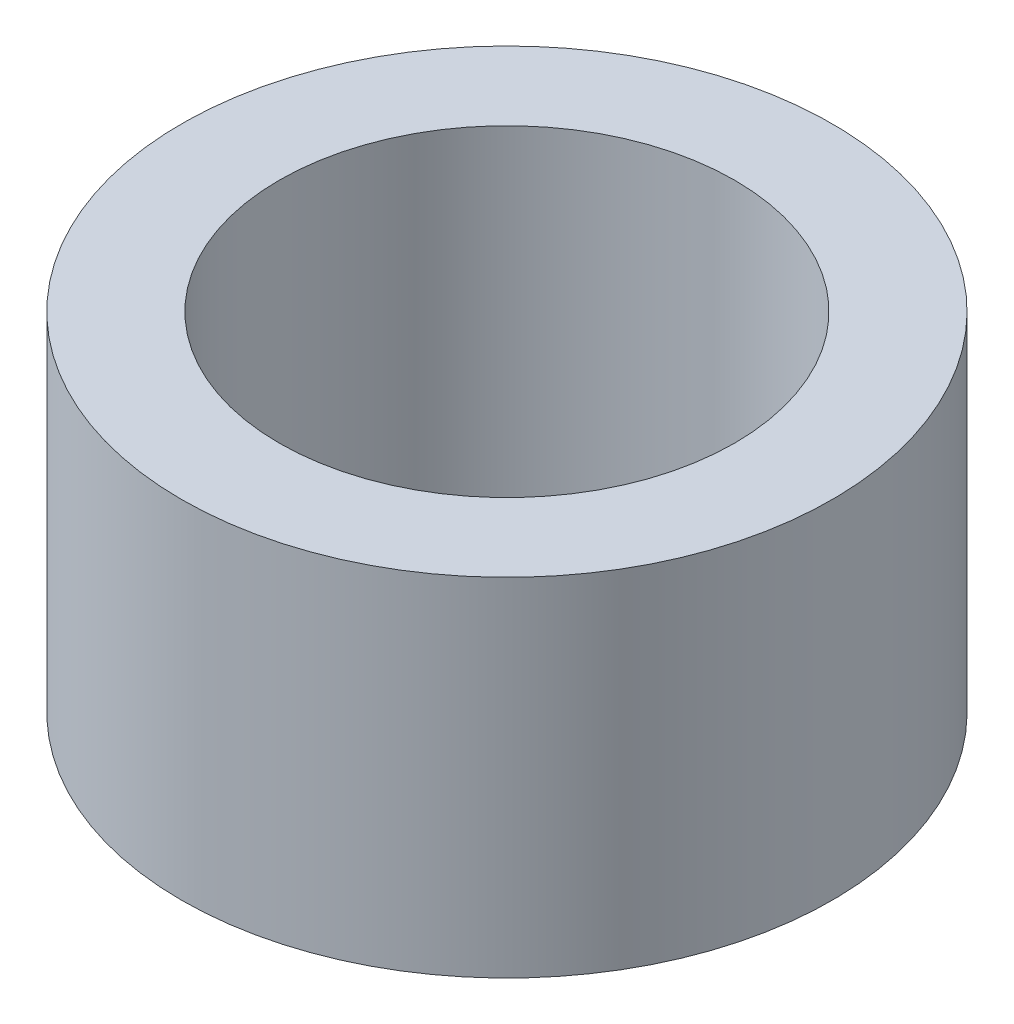
ISO-10303-21;
HEADER;
FILE_DESCRIPTION(('STEP AP214'),'2;1');
FILE_NAME('part.step','',(''),(''),'','','');
FILE_SCHEMA(('AUTOMOTIVE_DESIGN { 1 0 10303 214 1 1 1 1 }'));
ENDSEC;
DATA;
#1=APPLICATION_CONTEXT('core data for automotive mechanical design processes');
#2=APPLICATION_PROTOCOL_DEFINITION('international standard','automotive_design',2000,#1);
#3=PRODUCT_CONTEXT('',#1,'mechanical');
#4=PRODUCT('Part','Part','',(#3));
#5=PRODUCT_RELATED_PRODUCT_CATEGORY('part','',(#4));
#6=PRODUCT_DEFINITION_FORMATION('','',#4);
#7=PRODUCT_DEFINITION_CONTEXT('part definition',#1,'design');
#8=PRODUCT_DEFINITION('design','',#6,#7);
#9=PRODUCT_DEFINITION_SHAPE('','',#8);
#10=(LENGTH_UNIT() NAMED_UNIT(*) SI_UNIT(.MILLI.,.METRE.));
#11=(NAMED_UNIT(*) PLANE_ANGLE_UNIT() SI_UNIT($,.RADIAN.));
#12=(NAMED_UNIT(*) SI_UNIT($,.STERADIAN.) SOLID_ANGLE_UNIT());
#13=UNCERTAINTY_MEASURE_WITH_UNIT(LENGTH_MEASURE(1.E-05),#10,'distance_accuracy_value','');
#14=(GEOMETRIC_REPRESENTATION_CONTEXT(3) GLOBAL_UNCERTAINTY_ASSIGNED_CONTEXT((#13)) GLOBAL_UNIT_ASSIGNED_CONTEXT((#10,
#11,#12)) REPRESENTATION_CONTEXT('',''));
#15=CARTESIAN_POINT('',(0.,0.,0.));
#16=DIRECTION('',(0.,0.,1.));
#17=DIRECTION('',(1.,0.,0.));
#18=AXIS2_PLACEMENT_3D('',#15,#16,#17);
#19=CARTESIAN_POINT('',(0.,-3.048,0.));
#20=DIRECTION('',(0.,1.,0.));
#21=DIRECTION('',(0.,0.,1.));
#22=AXIS2_PLACEMENT_3D('',#19,#20,#21);
#23=CYLINDRICAL_SURFACE('',#22,2.8575);
#24=CARTESIAN_POINT('',(0.,-3.048,0.));
#25=DIRECTION('',(0.,1.,0.));
#26=DIRECTION('',(0.,0.,1.));
#27=AXIS2_PLACEMENT_3D('',#24,#25,#26);
#28=CIRCLE('',#27,2.8575);
#29=CARTESIAN_POINT('',(0.,-3.048,2.8575));
#30=VERTEX_POINT('',#29);
#31=EDGE_CURVE('E10',#30,#30,#28,.T.);
#32=CARTESIAN_POINT('',(0.,0.,0.));
#33=DIRECTION('',(0.,1.,0.));
#34=DIRECTION('',(0.,0.,1.));
#35=AXIS2_PLACEMENT_3D('',#32,#33,#34);
#36=CIRCLE('',#35,2.8575);
#37=CARTESIAN_POINT('',(0.,0.,2.8575));
#38=VERTEX_POINT('',#37);
#39=EDGE_CURVE('E40',#38,#38,#36,.T.);
#40=CARTESIAN_POINT('',(0.,-3.048,2.8575));
#41=CARTESIAN_POINT('',(0.,-3.01625,2.8575));
#42=CARTESIAN_POINT('',(0.,-2.9845,2.8575));
#43=CARTESIAN_POINT('',(0.,-2.921,2.8575));
#44=CARTESIAN_POINT('',(0.,-2.88925,2.8575));
#45=CARTESIAN_POINT('',(0.,-2.82575,2.8575));
#46=CARTESIAN_POINT('',(0.,-2.794,2.8575));
#47=CARTESIAN_POINT('',(0.,-2.7305,2.8575));
#48=CARTESIAN_POINT('',(0.,-2.69875,2.8575));
#49=CARTESIAN_POINT('',(0.,-2.63525,2.8575));
#50=CARTESIAN_POINT('',(0.,-2.6035,2.8575));
#51=CARTESIAN_POINT('',(0.,-2.54,2.8575));
#52=CARTESIAN_POINT('',(0.,-2.50825,2.8575));
#53=CARTESIAN_POINT('',(0.,-2.44475,2.8575));
#54=CARTESIAN_POINT('',(0.,-2.413,2.8575));
#55=CARTESIAN_POINT('',(0.,-2.3495,2.8575));
#56=CARTESIAN_POINT('',(0.,-2.31775,2.8575));
#57=CARTESIAN_POINT('',(0.,-2.25425,2.8575));
#58=CARTESIAN_POINT('',(0.,-2.2225,2.8575));
#59=CARTESIAN_POINT('',(0.,-2.159,2.8575));
#60=CARTESIAN_POINT('',(0.,-2.12725,2.8575));
#61=CARTESIAN_POINT('',(0.,-2.06375,2.8575));
#62=CARTESIAN_POINT('',(0.,-2.032,2.8575));
#63=CARTESIAN_POINT('',(0.,-1.9685,2.8575));
#64=CARTESIAN_POINT('',(0.,-1.93675,2.8575));
#65=CARTESIAN_POINT('',(0.,-1.87325,2.8575));
#66=CARTESIAN_POINT('',(0.,-1.8415,2.8575));
#67=CARTESIAN_POINT('',(0.,-1.778,2.8575));
#68=CARTESIAN_POINT('',(0.,-1.74625,2.8575));
#69=CARTESIAN_POINT('',(0.,-1.68275,2.8575));
#70=CARTESIAN_POINT('',(0.,-1.651,2.8575));
#71=CARTESIAN_POINT('',(0.,-1.5875,2.8575));
#72=CARTESIAN_POINT('',(0.,-1.55575,2.8575));
#73=CARTESIAN_POINT('',(0.,-1.49225,2.8575));
#74=CARTESIAN_POINT('',(0.,-1.4605,2.8575));
#75=CARTESIAN_POINT('',(0.,-1.397,2.8575));
#76=CARTESIAN_POINT('',(0.,-1.36525,2.8575));
#77=CARTESIAN_POINT('',(0.,-1.30175,2.8575));
#78=CARTESIAN_POINT('',(0.,-1.27,2.8575));
#79=CARTESIAN_POINT('',(0.,-1.2065,2.8575));
#80=CARTESIAN_POINT('',(0.,-1.17475,2.8575));
#81=CARTESIAN_POINT('',(0.,-1.11125,2.8575));
#82=CARTESIAN_POINT('',(0.,-1.0795,2.8575));
#83=CARTESIAN_POINT('',(0.,-1.016,2.8575));
#84=CARTESIAN_POINT('',(0.,-0.98425,2.8575));
#85=CARTESIAN_POINT('',(0.,-0.92075,2.8575));
#86=CARTESIAN_POINT('',(0.,-0.889,2.8575));
#87=CARTESIAN_POINT('',(0.,-0.8255,2.8575));
#88=CARTESIAN_POINT('',(0.,-0.79375,2.8575));
#89=CARTESIAN_POINT('',(0.,-0.73025,2.8575));
#90=CARTESIAN_POINT('',(0.,-0.6985,2.8575));
#91=CARTESIAN_POINT('',(0.,-0.635,2.8575));
#92=CARTESIAN_POINT('',(0.,-0.60325,2.8575));
#93=CARTESIAN_POINT('',(0.,-0.53975,2.8575));
#94=CARTESIAN_POINT('',(0.,-0.508,2.8575));
#95=CARTESIAN_POINT('',(0.,-0.4445,2.8575));
#96=CARTESIAN_POINT('',(0.,-0.41275,2.8575));
#97=CARTESIAN_POINT('',(0.,-0.34925,2.8575));
#98=CARTESIAN_POINT('',(0.,-0.3175,2.8575));
#99=CARTESIAN_POINT('',(0.,-0.254,2.8575));
#100=CARTESIAN_POINT('',(0.,-0.22225,2.8575));
#101=CARTESIAN_POINT('',(0.,-0.15875,2.8575));
#102=CARTESIAN_POINT('',(0.,-0.127,2.8575));
#103=CARTESIAN_POINT('',(0.,-0.0634999999999999,2.8575));
#104=CARTESIAN_POINT('',(0.,-0.03175,2.8575));
#105=CARTESIAN_POINT('',(0.,0.,2.8575));
#106=B_SPLINE_CURVE_WITH_KNOTS('',3,(#40,#41,#42,#43,#44,#45,#46,#47,#48,#49,#50,#51,#52,#53,
#54,#55,#56,#57,#58,#59,#60,#61,#62,#63,#64,#65,#66,#67,#68,#69,#70,#71,#72,#73,#74,#75,#76,#77,
#78,#79,#80,#81,#82,#83,#84,#85,#86,#87,#88,#89,#90,#91,#92,#93,#94,#95,#96,#97,#98,#99,#100,
#101,#102,#103,#104,#105),.UNSPECIFIED.,.F.,.F.,(4,2,2,2,2,2,2,2,2,2,2,2,2,2,2,2,2,2,2,2,2,2,2,
2,2,2,2,2,2,2,2,2,4),(0.,0.0952499999999998,0.1905,0.28575,0.381,0.47625,0.5715,0.66675,0.762,
0.85725,0.9525,1.04775,1.143,1.23825,1.3335,1.42875,1.524,1.61925,1.7145,1.80975,1.905,2.00025,
2.0955,2.19075,2.286,2.38125,2.4765,2.57175,2.667,2.76225,2.8575,2.95275,3.048),.UNSPECIFIED.);
#107=EDGE_CURVE('BSEAM37',#30,#38,#106,.T.);
#108=ORIENTED_EDGE('',*,*,#31,.T.);
#109=ORIENTED_EDGE('',*,*,#39,.F.);
#110=ORIENTED_EDGE('',*,*,#107,.T.);
#111=ORIENTED_EDGE('',*,*,#107,.F.);
#112=EDGE_LOOP('',(#108,#110,#109,#111));
#113=FACE_BOUND('',#112,.T.);
#114=ADVANCED_FACE('F37',(#113),#23,.T.);
#115=CARTESIAN_POINT('',(0.,-3.048,0.));
#116=DIRECTION('',(0.,1.,0.));
#117=DIRECTION('',(0.,0.,1.));
#118=AXIS2_PLACEMENT_3D('',#115,#116,#117);
#119=PLANE('',#118);
#120=CARTESIAN_POINT('',(0.,-3.048,0.));
#121=DIRECTION('',(0.,1.,0.));
#122=DIRECTION('',(0.,0.,1.));
#123=AXIS2_PLACEMENT_3D('',#120,#121,#122);
#124=CIRCLE('',#123,2.);
#125=CARTESIAN_POINT('',(0.,-3.048,2.));
#126=VERTEX_POINT('',#125);
#127=EDGE_CURVE('E49',#126,#126,#124,.T.);
#128=ORIENTED_EDGE('',*,*,#127,.T.);
#129=EDGE_LOOP('',(#128));
#130=FACE_BOUND('',#129,.T.);
#131=ORIENTED_EDGE('',*,*,#31,.F.);
#132=EDGE_LOOP('',(#131));
#133=FACE_BOUND('',#132,.T.);
#134=ADVANCED_FACE('F59',(#130,#133),#119,.F.);
#135=CARTESIAN_POINT('',(0.,0.,0.));
#136=DIRECTION('',(0.,1.,0.));
#137=DIRECTION('',(0.,0.,1.));
#138=AXIS2_PLACEMENT_3D('',#135,#136,#137);
#139=PLANE('',#138);
#140=CARTESIAN_POINT('',(0.,0.,0.));
#141=DIRECTION('',(0.,1.,0.));
#142=DIRECTION('',(0.,0.,1.));
#143=AXIS2_PLACEMENT_3D('',#140,#141,#142);
#144=CIRCLE('',#143,2.);
#145=CARTESIAN_POINT('',(0.,0.,2.));
#146=VERTEX_POINT('',#145);
#147=EDGE_CURVE('E51',#146,#146,#144,.T.);
#148=ORIENTED_EDGE('',*,*,#147,.F.);
#149=EDGE_LOOP('',(#148));
#150=FACE_BOUND('',#149,.T.);
#151=ORIENTED_EDGE('',*,*,#39,.T.);
#152=EDGE_LOOP('',(#151));
#153=FACE_BOUND('',#152,.T.);
#154=ADVANCED_FACE('F65',(#150,#153),#139,.T.);
#155=CARTESIAN_POINT('',(0.,-3.048,0.));
#156=DIRECTION('',(0.,1.,0.));
#157=DIRECTION('',(0.,0.,1.));
#158=AXIS2_PLACEMENT_3D('',#155,#156,#157);
#159=CYLINDRICAL_SURFACE('',#158,2.);
#160=CARTESIAN_POINT('',(0.,-3.048,2.));
#161=CARTESIAN_POINT('',(0.,-3.01625,2.));
#162=CARTESIAN_POINT('',(0.,-2.9845,2.));
#163=CARTESIAN_POINT('',(0.,-2.921,2.));
#164=CARTESIAN_POINT('',(0.,-2.88925,2.));
#165=CARTESIAN_POINT('',(0.,-2.82575,2.));
#166=CARTESIAN_POINT('',(0.,-2.794,2.));
#167=CARTESIAN_POINT('',(0.,-2.7305,2.));
#168=CARTESIAN_POINT('',(0.,-2.69875,2.));
#169=CARTESIAN_POINT('',(0.,-2.63525,2.));
#170=CARTESIAN_POINT('',(0.,-2.6035,2.));
#171=CARTESIAN_POINT('',(0.,-2.54,2.));
#172=CARTESIAN_POINT('',(0.,-2.50825,2.));
#173=CARTESIAN_POINT('',(0.,-2.44475,2.));
#174=CARTESIAN_POINT('',(0.,-2.413,2.));
#175=CARTESIAN_POINT('',(0.,-2.3495,2.));
#176=CARTESIAN_POINT('',(0.,-2.31775,2.));
#177=CARTESIAN_POINT('',(0.,-2.25425,2.));
#178=CARTESIAN_POINT('',(0.,-2.2225,2.));
#179=CARTESIAN_POINT('',(0.,-2.159,2.));
#180=CARTESIAN_POINT('',(0.,-2.12725,2.));
#181=CARTESIAN_POINT('',(0.,-2.06375,2.));
#182=CARTESIAN_POINT('',(0.,-2.032,2.));
#183=CARTESIAN_POINT('',(0.,-1.9685,2.));
#184=CARTESIAN_POINT('',(0.,-1.93675,2.));
#185=CARTESIAN_POINT('',(0.,-1.87325,2.));
#186=CARTESIAN_POINT('',(0.,-1.8415,2.));
#187=CARTESIAN_POINT('',(0.,-1.778,2.));
#188=CARTESIAN_POINT('',(0.,-1.74625,2.));
#189=CARTESIAN_POINT('',(0.,-1.68275,2.));
#190=CARTESIAN_POINT('',(0.,-1.651,2.));
#191=CARTESIAN_POINT('',(0.,-1.5875,2.));
#192=CARTESIAN_POINT('',(0.,-1.55575,2.));
#193=CARTESIAN_POINT('',(0.,-1.49225,2.));
#194=CARTESIAN_POINT('',(0.,-1.4605,2.));
#195=CARTESIAN_POINT('',(0.,-1.397,2.));
#196=CARTESIAN_POINT('',(0.,-1.36525,2.));
#197=CARTESIAN_POINT('',(0.,-1.30175,2.));
#198=CARTESIAN_POINT('',(0.,-1.27,2.));
#199=CARTESIAN_POINT('',(0.,-1.2065,2.));
#200=CARTESIAN_POINT('',(0.,-1.17475,2.));
#201=CARTESIAN_POINT('',(0.,-1.11125,2.));
#202=CARTESIAN_POINT('',(0.,-1.0795,2.));
#203=CARTESIAN_POINT('',(0.,-1.016,2.));
#204=CARTESIAN_POINT('',(0.,-0.98425,2.));
#205=CARTESIAN_POINT('',(0.,-0.92075,2.));
#206=CARTESIAN_POINT('',(0.,-0.889,2.));
#207=CARTESIAN_POINT('',(0.,-0.8255,2.));
#208=CARTESIAN_POINT('',(0.,-0.79375,2.));
#209=CARTESIAN_POINT('',(0.,-0.73025,2.));
#210=CARTESIAN_POINT('',(0.,-0.6985,2.));
#211=CARTESIAN_POINT('',(0.,-0.635,2.));
#212=CARTESIAN_POINT('',(0.,-0.60325,2.));
#213=CARTESIAN_POINT('',(0.,-0.53975,2.));
#214=CARTESIAN_POINT('',(0.,-0.508,2.));
#215=CARTESIAN_POINT('',(0.,-0.4445,2.));
#216=CARTESIAN_POINT('',(0.,-0.41275,2.));
#217=CARTESIAN_POINT('',(0.,-0.34925,2.));
#218=CARTESIAN_POINT('',(0.,-0.3175,2.));
#219=CARTESIAN_POINT('',(0.,-0.254,2.));
#220=CARTESIAN_POINT('',(0.,-0.22225,2.));
#221=CARTESIAN_POINT('',(0.,-0.15875,2.));
#222=CARTESIAN_POINT('',(0.,-0.127,2.));
#223=CARTESIAN_POINT('',(0.,-0.0634999999999999,2.));
#224=CARTESIAN_POINT('',(0.,-0.03175,2.));
#225=CARTESIAN_POINT('',(0.,0.,2.));
#226=B_SPLINE_CURVE_WITH_KNOTS('',3,(#160,#161,#162,#163,#164,#165,#166,#167,#168,#169,#170,
#171,#172,#173,#174,#175,#176,#177,#178,#179,#180,#181,#182,#183,#184,#185,#186,#187,#188,#189,
#190,#191,#192,#193,#194,#195,#196,#197,#198,#199,#200,#201,#202,#203,#204,#205,#206,#207,#208,
#209,#210,#211,#212,#213,#214,#215,#216,#217,#218,#219,#220,#221,#222,#223,#224,#225),
.UNSPECIFIED.,.F.,.F.,(4,2,2,2,2,2,2,2,2,2,2,2,2,2,2,2,2,2,2,2,2,2,2,2,2,2,2,2,2,2,2,2,4),(0.,
0.0952500000000003,0.1905,0.28575,0.381,0.47625,0.5715,0.66675,0.762000000000001,0.85725,0.9525,
1.04775,1.143,1.23825,1.3335,1.42875,1.524,1.61925,1.7145,1.80975,1.905,2.00025,2.0955,2.19075,
2.286,2.38125,2.4765,2.57175,2.667,2.76225,2.8575,2.95275,3.048),.UNSPECIFIED.);
#227=EDGE_CURVE('BSEAM62',#126,#146,#226,.T.);
#228=ORIENTED_EDGE('',*,*,#127,.F.);
#229=ORIENTED_EDGE('',*,*,#147,.T.);
#230=ORIENTED_EDGE('',*,*,#227,.T.);
#231=ORIENTED_EDGE('',*,*,#227,.F.);
#232=EDGE_LOOP('',(#228,#230,#229,#231));
#233=FACE_BOUND('',#232,.T.);
#234=ADVANCED_FACE('F62',(#233),#159,.F.);
#235=CLOSED_SHELL('',(#114,#134,#154,#234));
#236=MANIFOLD_SOLID_BREP('B2',#235);
#237=ADVANCED_BREP_SHAPE_REPRESENTATION('',(#18,#236),#14);
#238=SHAPE_DEFINITION_REPRESENTATION(#9,#237);
ENDSEC;
END-ISO-10303-21;
